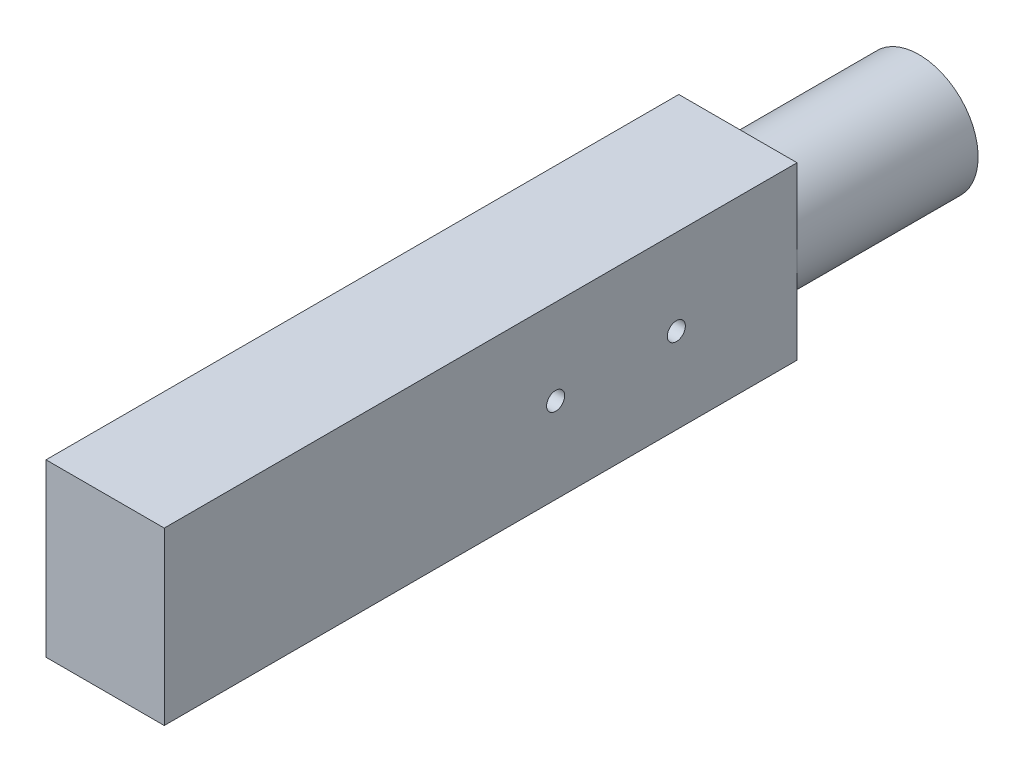
ISO-10303-21;
HEADER;
FILE_DESCRIPTION(('STEP AP214'),'2;1');
FILE_NAME('part.step','',(''),(''),'','','');
FILE_SCHEMA(('AUTOMOTIVE_DESIGN { 1 0 10303 214 1 1 1 1 }'));
ENDSEC;
DATA;
#1=APPLICATION_CONTEXT('core data for automotive mechanical design processes');
#2=APPLICATION_PROTOCOL_DEFINITION('international standard','automotive_design',2000,#1);
#3=PRODUCT_CONTEXT('',#1,'mechanical');
#4=PRODUCT('Part','Part','',(#3));
#5=PRODUCT_RELATED_PRODUCT_CATEGORY('part','',(#4));
#6=PRODUCT_DEFINITION_FORMATION('','',#4);
#7=PRODUCT_DEFINITION_CONTEXT('part definition',#1,'design');
#8=PRODUCT_DEFINITION('design','',#6,#7);
#9=PRODUCT_DEFINITION_SHAPE('','',#8);
#10=(LENGTH_UNIT() NAMED_UNIT(*) SI_UNIT(.MILLI.,.METRE.));
#11=(NAMED_UNIT(*) PLANE_ANGLE_UNIT() SI_UNIT($,.RADIAN.));
#12=(NAMED_UNIT(*) SI_UNIT($,.STERADIAN.) SOLID_ANGLE_UNIT());
#13=UNCERTAINTY_MEASURE_WITH_UNIT(LENGTH_MEASURE(1.E-05),#10,'distance_accuracy_value','');
#14=(GEOMETRIC_REPRESENTATION_CONTEXT(3) GLOBAL_UNCERTAINTY_ASSIGNED_CONTEXT((#13)) GLOBAL_UNIT_ASSIGNED_CONTEXT((#10,
#11,#12)) REPRESENTATION_CONTEXT('',''));
#15=CARTESIAN_POINT('',(0.,0.,0.));
#16=DIRECTION('',(0.,0.,1.));
#17=DIRECTION('',(1.,0.,0.));
#18=AXIS2_PLACEMENT_3D('',#15,#16,#17);
#19=CARTESIAN_POINT('',(0.,0.,0.));
#20=DIRECTION('',(0.,0.,-1.));
#21=DIRECTION('',(-1.,0.,0.));
#22=AXIS2_PLACEMENT_3D('',#19,#20,#21);
#23=PLANE('',#22);
#24=CARTESIAN_POINT('',(9.79671523,14.16755741,0.));
#25=DIRECTION('',(0.,0.,-1.));
#26=DIRECTION('',(-1.,0.,0.));
#27=AXIS2_PLACEMENT_3D('',#24,#25,#26);
#28=CIRCLE('',#27,9.79671523);
#29=CARTESIAN_POINT('',(0.,14.16755741,0.));
#30=VERTEX_POINT('',#29);
#31=CARTESIAN_POINT('',(19.59343046,14.16755741,0.));
#32=VERTEX_POINT('',#31);
#33=EDGE_CURVE('E46',#30,#32,#28,.T.);
#34=ORIENTED_EDGE('',*,*,#33,.F.);
#35=DIRECTION('',(0.,-1.,0.));
#36=VECTOR('',#35,1.);
#37=CARTESIAN_POINT('',(0.,0.,0.));
#38=LINE('',#37,#36);
#39=CARTESIAN_POINT('',(0.,28.33511482,0.));
#40=VERTEX_POINT('',#39);
#41=EDGE_CURVE('E94',#40,#30,#38,.T.);
#42=ORIENTED_EDGE('',*,*,#41,.F.);
#43=DIRECTION('',(-1.,0.,0.));
#44=VECTOR('',#43,1.);
#45=CARTESIAN_POINT('',(0.,28.33511482,0.));
#46=LINE('',#45,#44);
#47=CARTESIAN_POINT('',(19.59343046,28.33511482,0.));
#48=VERTEX_POINT('',#47);
#49=EDGE_CURVE('E81',#48,#40,#46,.T.);
#50=ORIENTED_EDGE('',*,*,#49,.F.);
#51=DIRECTION('',(0.,1.,0.));
#52=VECTOR('',#51,1.);
#53=CARTESIAN_POINT('',(19.59343046,0.,0.));
#54=LINE('',#53,#52);
#55=EDGE_CURVE('E107',#32,#48,#54,.T.);
#56=ORIENTED_EDGE('',*,*,#55,.F.);
#57=EDGE_LOOP('',(#34,#42,#50,#56));
#58=FACE_BOUND('',#57,.T.);
#59=ADVANCED_FACE('F36',(#58),#23,.T.);
#60=CARTESIAN_POINT('',(0.,0.,104.84505691));
#61=DIRECTION('',(1.,0.,0.));
#62=DIRECTION('',(0.,0.,-1.));
#63=AXIS2_PLACEMENT_3D('',#60,#61,#62);
#64=PLANE('',#63);
#65=CARTESIAN_POINT('',(0.,14.16755741,20.));
#66=DIRECTION('',(1.,0.,0.));
#67=DIRECTION('',(0.,0.,-1.));
#68=AXIS2_PLACEMENT_3D('',#65,#66,#67);
#69=CIRCLE('',#68,1.5);
#70=CARTESIAN_POINT('',(0.,14.16755741,18.5));
#71=VERTEX_POINT('',#70);
#72=EDGE_CURVE('E110',#71,#71,#69,.T.);
#73=ORIENTED_EDGE('',*,*,#72,.T.);
#74=EDGE_LOOP('',(#73));
#75=FACE_BOUND('',#74,.T.);
#76=CARTESIAN_POINT('',(0.,14.16755741,40.));
#77=DIRECTION('',(1.,0.,0.));
#78=DIRECTION('',(0.,0.,-1.));
#79=AXIS2_PLACEMENT_3D('',#76,#77,#78);
#80=CIRCLE('',#79,1.5);
#81=CARTESIAN_POINT('',(0.,14.16755741,38.5));
#82=VERTEX_POINT('',#81);
#83=EDGE_CURVE('E164',#82,#82,#80,.T.);
#84=ORIENTED_EDGE('',*,*,#83,.T.);
#85=EDGE_LOOP('',(#84));
#86=FACE_BOUND('',#85,.T.);
#87=ORIENTED_EDGE('',*,*,#41,.T.);
#88=CARTESIAN_POINT('',(0.,0.,0.));
#89=VERTEX_POINT('',#88);
#90=EDGE_CURVE('E96',#30,#89,#38,.T.);
#91=ORIENTED_EDGE('',*,*,#90,.T.);
#92=DIRECTION('',(0.,0.,-1.));
#93=VECTOR('',#92,1.);
#94=CARTESIAN_POINT('',(0.,0.,104.84505691));
#95=LINE('',#94,#93);
#96=CARTESIAN_POINT('',(0.,0.,104.84505691));
#97=VERTEX_POINT('',#96);
#98=EDGE_CURVE('E40',#97,#89,#95,.T.);
#99=ORIENTED_EDGE('',*,*,#98,.F.);
#100=DIRECTION('',(0.,-1.,0.));
#101=VECTOR('',#100,1.);
#102=CARTESIAN_POINT('',(0.,0.,104.84505691));
#103=LINE('',#102,#101);
#104=CARTESIAN_POINT('',(0.,28.33511482,104.84505691));
#105=VERTEX_POINT('',#104);
#106=EDGE_CURVE('E153',#105,#97,#103,.T.);
#107=ORIENTED_EDGE('',*,*,#106,.F.);
#108=DIRECTION('',(0.,0.,-1.));
#109=VECTOR('',#108,1.);
#110=CARTESIAN_POINT('',(0.,28.33511482,104.84505691));
#111=LINE('',#110,#109);
#112=EDGE_CURVE('E99',#105,#40,#111,.T.);
#113=ORIENTED_EDGE('',*,*,#112,.T.);
#114=EDGE_LOOP('',(#87,#91,#99,#107,#113));
#115=FACE_BOUND('',#114,.T.);
#116=ADVANCED_FACE('F38',(#75,#86,#115),#64,.F.);
#117=CARTESIAN_POINT('',(0.,0.,104.84505691));
#118=DIRECTION('',(0.,1.,0.));
#119=DIRECTION('',(0.,0.,1.));
#120=AXIS2_PLACEMENT_3D('',#117,#118,#119);
#121=PLANE('',#120);
#122=DIRECTION('',(1.,0.,0.));
#123=VECTOR('',#122,1.);
#124=CARTESIAN_POINT('',(0.,0.,0.));
#125=LINE('',#124,#123);
#126=CARTESIAN_POINT('',(19.59343046,0.,0.));
#127=VERTEX_POINT('',#126);
#128=EDGE_CURVE('E102',#89,#127,#125,.T.);
#129=ORIENTED_EDGE('',*,*,#128,.T.);
#130=DIRECTION('',(0.,0.,-1.));
#131=VECTOR('',#130,1.);
#132=CARTESIAN_POINT('',(19.59343046,0.,104.84505691));
#133=LINE('',#132,#131);
#134=CARTESIAN_POINT('',(19.59343046,0.,104.84505691));
#135=VERTEX_POINT('',#134);
#136=EDGE_CURVE('E144',#135,#127,#133,.T.);
#137=ORIENTED_EDGE('',*,*,#136,.F.);
#138=DIRECTION('',(1.,0.,0.));
#139=VECTOR('',#138,1.);
#140=CARTESIAN_POINT('',(0.,0.,104.84505691));
#141=LINE('',#140,#139);
#142=EDGE_CURVE('E89',#97,#135,#141,.T.);
#143=ORIENTED_EDGE('',*,*,#142,.F.);
#144=ORIENTED_EDGE('',*,*,#98,.T.);
#145=EDGE_LOOP('',(#129,#137,#143,#144));
#146=FACE_BOUND('',#145,.T.);
#147=ADVANCED_FACE('F131',(#146),#121,.F.);
#148=CARTESIAN_POINT('',(19.59343046,0.,104.84505691));
#149=DIRECTION('',(-1.,0.,0.));
#150=DIRECTION('',(0.,0.,1.));
#151=AXIS2_PLACEMENT_3D('',#148,#149,#150);
#152=PLANE('',#151);
#153=CARTESIAN_POINT('',(19.59343046,14.16755741,20.));
#154=DIRECTION('',(1.,0.,0.));
#155=DIRECTION('',(0.,0.,-1.));
#156=AXIS2_PLACEMENT_3D('',#153,#154,#155);
#157=CIRCLE('',#156,1.5);
#158=CARTESIAN_POINT('',(19.59343046,14.16755741,18.5));
#159=VERTEX_POINT('',#158);
#160=EDGE_CURVE('E170',#159,#159,#157,.T.);
#161=ORIENTED_EDGE('',*,*,#160,.F.);
#162=EDGE_LOOP('',(#161));
#163=FACE_BOUND('',#162,.T.);
#164=CARTESIAN_POINT('',(19.59343046,14.16755741,40.));
#165=DIRECTION('',(1.,0.,0.));
#166=DIRECTION('',(0.,0.,-1.));
#167=AXIS2_PLACEMENT_3D('',#164,#165,#166);
#168=CIRCLE('',#167,1.5);
#169=CARTESIAN_POINT('',(19.59343046,14.16755741,38.5));
#170=VERTEX_POINT('',#169);
#171=EDGE_CURVE('E167',#170,#170,#168,.T.);
#172=ORIENTED_EDGE('',*,*,#171,.F.);
#173=EDGE_LOOP('',(#172));
#174=FACE_BOUND('',#173,.T.);
#175=EDGE_CURVE('E148',#127,#32,#54,.T.);
#176=ORIENTED_EDGE('',*,*,#175,.T.);
#177=ORIENTED_EDGE('',*,*,#55,.T.);
#178=DIRECTION('',(0.,0.,-1.));
#179=VECTOR('',#178,1.);
#180=CARTESIAN_POINT('',(19.59343046,28.33511482,104.84505691));
#181=LINE('',#180,#179);
#182=CARTESIAN_POINT('',(19.59343046,28.33511482,104.84505691));
#183=VERTEX_POINT('',#182);
#184=EDGE_CURVE('E151',#183,#48,#181,.T.);
#185=ORIENTED_EDGE('',*,*,#184,.F.);
#186=DIRECTION('',(0.,1.,0.));
#187=VECTOR('',#186,1.);
#188=CARTESIAN_POINT('',(19.59343046,0.,104.84505691));
#189=LINE('',#188,#187);
#190=EDGE_CURVE('E150',#135,#183,#189,.T.);
#191=ORIENTED_EDGE('',*,*,#190,.F.);
#192=ORIENTED_EDGE('',*,*,#136,.T.);
#193=EDGE_LOOP('',(#176,#177,#185,#191,#192));
#194=FACE_BOUND('',#193,.T.);
#195=ADVANCED_FACE('F137',(#163,#174,#194),#152,.F.);
#196=CARTESIAN_POINT('',(0.,28.33511482,104.84505691));
#197=DIRECTION('',(0.,-1.,0.));
#198=DIRECTION('',(0.,0.,-1.));
#199=AXIS2_PLACEMENT_3D('',#196,#197,#198);
#200=PLANE('',#199);
#201=ORIENTED_EDGE('',*,*,#49,.T.);
#202=ORIENTED_EDGE('',*,*,#112,.F.);
#203=DIRECTION('',(-1.,0.,0.));
#204=VECTOR('',#203,1.);
#205=CARTESIAN_POINT('',(0.,28.33511482,104.84505691));
#206=LINE('',#205,#204);
#207=EDGE_CURVE('E60',#183,#105,#206,.T.);
#208=ORIENTED_EDGE('',*,*,#207,.F.);
#209=ORIENTED_EDGE('',*,*,#184,.T.);
#210=EDGE_LOOP('',(#201,#202,#208,#209));
#211=FACE_BOUND('',#210,.T.);
#212=ADVANCED_FACE('F134',(#211),#200,.F.);
#213=CARTESIAN_POINT('',(0.,0.,104.84505691));
#214=DIRECTION('',(0.,0.,-1.));
#215=DIRECTION('',(-1.,0.,0.));
#216=AXIS2_PLACEMENT_3D('',#213,#214,#215);
#217=PLANE('',#216);
#218=ORIENTED_EDGE('',*,*,#106,.T.);
#219=ORIENTED_EDGE('',*,*,#142,.T.);
#220=ORIENTED_EDGE('',*,*,#190,.T.);
#221=ORIENTED_EDGE('',*,*,#207,.T.);
#222=EDGE_LOOP('',(#218,#219,#220,#221));
#223=FACE_BOUND('',#222,.T.);
#224=ADVANCED_FACE('F123',(#223),#217,.F.);
#225=EDGE_CURVE('E11',#32,#30,#28,.T.);
#226=ORIENTED_EDGE('',*,*,#225,.F.);
#227=ORIENTED_EDGE('',*,*,#175,.F.);
#228=ORIENTED_EDGE('',*,*,#128,.F.);
#229=ORIENTED_EDGE('',*,*,#90,.F.);
#230=EDGE_LOOP('',(#226,#227,#228,#229));
#231=FACE_BOUND('',#230,.T.);
#232=ADVANCED_FACE('F104',(#231),#23,.T.);
#233=CARTESIAN_POINT('',(9.79671523,14.16755741,-30.));
#234=DIRECTION('',(0.,0.,1.));
#235=DIRECTION('',(1.,0.,0.));
#236=AXIS2_PLACEMENT_3D('',#233,#234,#235);
#237=CYLINDRICAL_SURFACE('',#236,9.79671523);
#238=CARTESIAN_POINT('',(9.79671523,14.16755741,-30.));
#239=DIRECTION('',(0.,0.,-1.));
#240=DIRECTION('',(-1.,0.,0.));
#241=AXIS2_PLACEMENT_3D('',#238,#239,#240);
#242=CIRCLE('',#241,9.79671523);
#243=CARTESIAN_POINT('',(0.,14.16755741,-30.));
#244=VERTEX_POINT('',#243);
#245=EDGE_CURVE('E105',#244,#244,#242,.T.);
#246=ORIENTED_EDGE('',*,*,#245,.F.);
#247=EDGE_LOOP('',(#246));
#248=FACE_BOUND('',#247,.T.);
#249=ORIENTED_EDGE('',*,*,#33,.T.);
#250=ORIENTED_EDGE('',*,*,#225,.T.);
#251=EDGE_LOOP('',(#249,#250));
#252=FACE_BOUND('',#251,.T.);
#253=ADVANCED_FACE('F111',(#248,#252),#237,.T.);
#254=CARTESIAN_POINT('',(9.79671523,14.16755741,-30.));
#255=DIRECTION('',(0.,0.,-1.));
#256=DIRECTION('',(-1.,0.,0.));
#257=AXIS2_PLACEMENT_3D('',#254,#255,#256);
#258=PLANE('',#257);
#259=ORIENTED_EDGE('',*,*,#245,.T.);
#260=EDGE_LOOP('',(#259));
#261=FACE_BOUND('',#260,.T.);
#262=ADVANCED_FACE('F113',(#261),#258,.T.);
#263=CARTESIAN_POINT('',(0.,14.16755741,40.));
#264=DIRECTION('',(1.,0.,0.));
#265=DIRECTION('',(0.,0.,-1.));
#266=AXIS2_PLACEMENT_3D('',#263,#264,#265);
#267=CYLINDRICAL_SURFACE('',#266,1.5);
#268=ORIENTED_EDGE('',*,*,#83,.F.);
#269=EDGE_LOOP('',(#268));
#270=FACE_BOUND('',#269,.T.);
#271=ORIENTED_EDGE('',*,*,#171,.T.);
#272=EDGE_LOOP('',(#271));
#273=FACE_BOUND('',#272,.T.);
#274=ADVANCED_FACE('F120',(#270,#273),#267,.F.);
#275=CARTESIAN_POINT('',(0.,14.16755741,20.));
#276=DIRECTION('',(1.,0.,0.));
#277=DIRECTION('',(0.,0.,-1.));
#278=AXIS2_PLACEMENT_3D('',#275,#276,#277);
#279=CYLINDRICAL_SURFACE('',#278,1.5);
#280=ORIENTED_EDGE('',*,*,#72,.F.);
#281=EDGE_LOOP('',(#280));
#282=FACE_BOUND('',#281,.T.);
#283=ORIENTED_EDGE('',*,*,#160,.T.);
#284=EDGE_LOOP('',(#283));
#285=FACE_BOUND('',#284,.T.);
#286=ADVANCED_FACE('F177',(#282,#285),#279,.F.);
#287=CLOSED_SHELL('',(#59,#116,#147,#195,#212,#224,#232,#253,#262,#274,#286));
#288=MANIFOLD_SOLID_BREP('B2',#287);
#289=ADVANCED_BREP_SHAPE_REPRESENTATION('',(#18,#288),#14);
#290=SHAPE_DEFINITION_REPRESENTATION(#9,#289);
ENDSEC;
END-ISO-10303-21;
